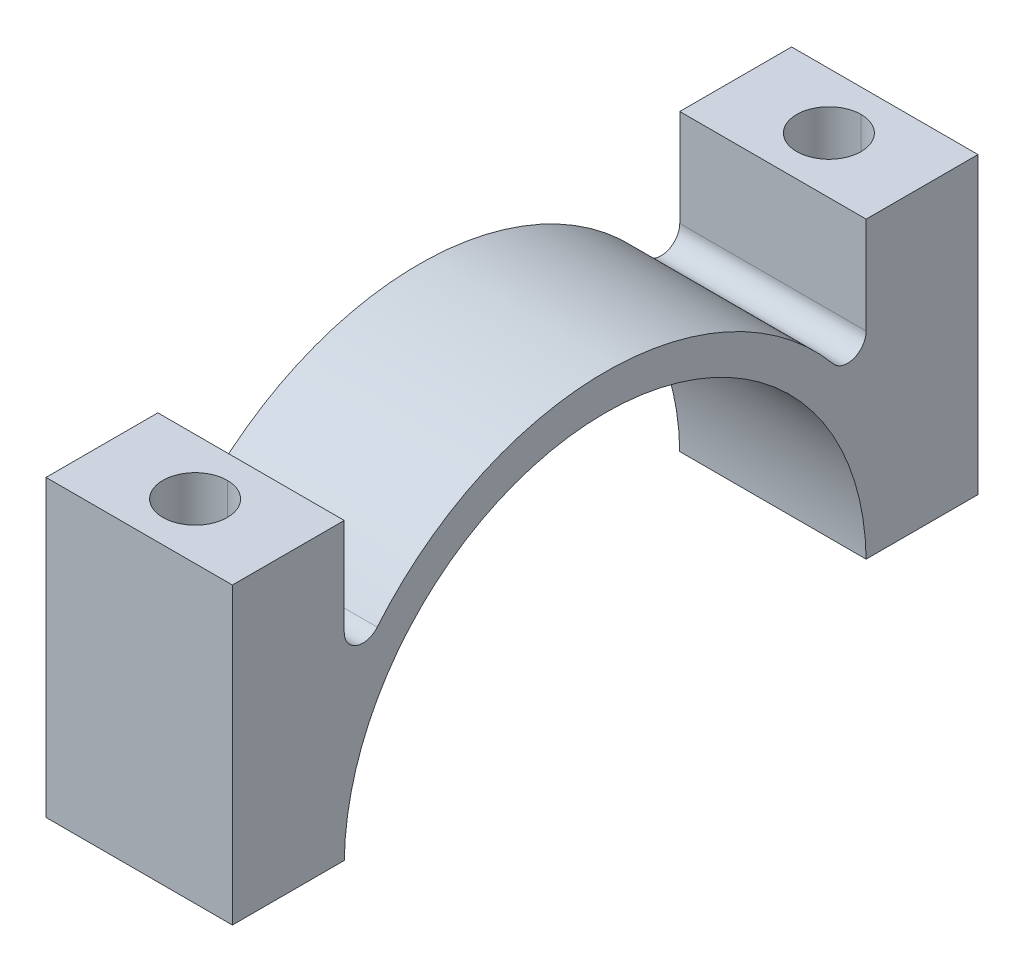
ISO-10303-21;
HEADER;
FILE_DESCRIPTION(('STEP AP214'),'2;1');
FILE_NAME('part.step','',(''),(''),'','','');
FILE_SCHEMA(('AUTOMOTIVE_DESIGN { 1 0 10303 214 1 1 1 1 }'));
ENDSEC;
DATA;
#1=APPLICATION_CONTEXT('core data for automotive mechanical design processes');
#2=APPLICATION_PROTOCOL_DEFINITION('international standard','automotive_design',2000,#1);
#3=PRODUCT_CONTEXT('',#1,'mechanical');
#4=PRODUCT('Part','Part','',(#3));
#5=PRODUCT_RELATED_PRODUCT_CATEGORY('part','',(#4));
#6=PRODUCT_DEFINITION_FORMATION('','',#4);
#7=PRODUCT_DEFINITION_CONTEXT('part definition',#1,'design');
#8=PRODUCT_DEFINITION('design','',#6,#7);
#9=PRODUCT_DEFINITION_SHAPE('','',#8);
#10=(LENGTH_UNIT() NAMED_UNIT(*) SI_UNIT(.MILLI.,.METRE.));
#11=(NAMED_UNIT(*) PLANE_ANGLE_UNIT() SI_UNIT($,.RADIAN.));
#12=(NAMED_UNIT(*) SI_UNIT($,.STERADIAN.) SOLID_ANGLE_UNIT());
#13=UNCERTAINTY_MEASURE_WITH_UNIT(LENGTH_MEASURE(1.E-05),#10,'distance_accuracy_value','');
#14=(GEOMETRIC_REPRESENTATION_CONTEXT(3) GLOBAL_UNCERTAINTY_ASSIGNED_CONTEXT((#13)) GLOBAL_UNIT_ASSIGNED_CONTEXT((#10,
#11,#12)) REPRESENTATION_CONTEXT('',''));
#15=CARTESIAN_POINT('',(0.,0.,0.));
#16=DIRECTION('',(0.,0.,1.));
#17=DIRECTION('',(1.,0.,0.));
#18=AXIS2_PLACEMENT_3D('',#15,#16,#17);
#19=CARTESIAN_POINT('',(5.,0.2,-17.));
#20=DIRECTION('',(0.,-1.,0.));
#21=DIRECTION('',(0.,0.,-1.));
#22=AXIS2_PLACEMENT_3D('',#19,#20,#21);
#23=CYLINDRICAL_SURFACE('',#22,1.7272);
#24=DIRECTION('',(0.,-1.,0.));
#25=VECTOR('',#24,1.);
#26=CARTESIAN_POINT('',(5.,0.2,-15.2728));
#27=LINE('',#26,#25);
#28=CARTESIAN_POINT('',(5.,16.,-15.2728));
#29=VERTEX_POINT('',#28);
#30=CARTESIAN_POINT('',(5.,0.2,-15.2728));
#31=VERTEX_POINT('',#30);
#32=EDGE_CURVE('E270',#29,#31,#27,.T.);
#33=ORIENTED_EDGE('',*,*,#32,.F.);
#34=CARTESIAN_POINT('',(5.,16.,-17.));
#35=DIRECTION('',(0.,-1.,0.));
#36=DIRECTION('',(0.,0.,-1.));
#37=AXIS2_PLACEMENT_3D('',#34,#35,#36);
#38=CIRCLE('',#37,1.7272);
#39=CARTESIAN_POINT('',(5.,16.,-18.7272));
#40=VERTEX_POINT('',#39);
#41=EDGE_CURVE('E202',#40,#29,#38,.T.);
#42=ORIENTED_EDGE('',*,*,#41,.F.);
#43=DIRECTION('',(0.,-1.,0.));
#44=VECTOR('',#43,1.);
#45=CARTESIAN_POINT('',(5.,0.2,-18.7272));
#46=LINE('',#45,#44);
#47=CARTESIAN_POINT('',(5.,0.2,-18.7272));
#48=VERTEX_POINT('',#47);
#49=EDGE_CURVE('E250',#40,#48,#46,.T.);
#50=ORIENTED_EDGE('',*,*,#49,.T.);
#51=CARTESIAN_POINT('',(5.,0.2,-17.));
#52=DIRECTION('',(0.,-1.,0.));
#53=DIRECTION('',(0.,0.,-1.));
#54=AXIS2_PLACEMENT_3D('',#51,#52,#53);
#55=CIRCLE('',#54,1.7272);
#56=EDGE_CURVE('E246',#48,#31,#55,.T.);
#57=ORIENTED_EDGE('',*,*,#56,.T.);
#58=EDGE_LOOP('',(#33,#42,#50,#57));
#59=FACE_BOUND('',#58,.T.);
#60=ADVANCED_FACE('F16',(#59),#23,.F.);
#61=CARTESIAN_POINT('',(5.,0.200000000000004,17.));
#62=DIRECTION('',(0.,-1.,0.));
#63=DIRECTION('',(0.,0.,-1.));
#64=AXIS2_PLACEMENT_3D('',#61,#62,#63);
#65=CYLINDRICAL_SURFACE('',#64,1.7272);
#66=DIRECTION('',(0.,-1.,0.));
#67=VECTOR('',#66,1.);
#68=CARTESIAN_POINT('',(5.,0.200000000000004,18.7272));
#69=LINE('',#68,#67);
#70=CARTESIAN_POINT('',(5.,16.,18.7272));
#71=VERTEX_POINT('',#70);
#72=CARTESIAN_POINT('',(5.,0.200000000000004,18.7272));
#73=VERTEX_POINT('',#72);
#74=EDGE_CURVE('E221',#71,#73,#69,.T.);
#75=ORIENTED_EDGE('',*,*,#74,.F.);
#76=CARTESIAN_POINT('',(5.,16.,17.));
#77=DIRECTION('',(0.,-1.,0.));
#78=DIRECTION('',(0.,0.,-1.));
#79=AXIS2_PLACEMENT_3D('',#76,#77,#78);
#80=CIRCLE('',#79,1.7272);
#81=CARTESIAN_POINT('',(5.,16.,15.2728));
#82=VERTEX_POINT('',#81);
#83=EDGE_CURVE('E230',#82,#71,#80,.T.);
#84=ORIENTED_EDGE('',*,*,#83,.F.);
#85=DIRECTION('',(0.,-1.,0.));
#86=VECTOR('',#85,1.);
#87=CARTESIAN_POINT('',(5.,0.200000000000004,15.2728));
#88=LINE('',#87,#86);
#89=CARTESIAN_POINT('',(5.,0.200000000000004,15.2728));
#90=VERTEX_POINT('',#89);
#91=EDGE_CURVE('E220',#82,#90,#88,.T.);
#92=ORIENTED_EDGE('',*,*,#91,.T.);
#93=CARTESIAN_POINT('',(5.,0.200000000000004,17.));
#94=DIRECTION('',(0.,-1.,0.));
#95=DIRECTION('',(0.,0.,-1.));
#96=AXIS2_PLACEMENT_3D('',#93,#94,#95);
#97=CIRCLE('',#96,1.7272);
#98=EDGE_CURVE('E167',#90,#73,#97,.T.);
#99=ORIENTED_EDGE('',*,*,#98,.T.);
#100=EDGE_LOOP('',(#75,#84,#92,#99));
#101=FACE_BOUND('',#100,.T.);
#102=ADVANCED_FACE('F429',(#101),#65,.F.);
#103=CARTESIAN_POINT('',(10.,10.7986110217935,-13.));
#104=DIRECTION('',(-1.,0.,0.));
#105=DIRECTION('',(0.,0.,1.));
#106=AXIS2_PLACEMENT_3D('',#103,#104,#105);
#107=CYLINDRICAL_SURFACE('',#106,1.);
#108=CARTESIAN_POINT('',(10.,10.7986110217935,-13.));
#109=DIRECTION('',(-1.,0.,0.));
#110=DIRECTION('',(0.,0.,1.));
#111=AXIS2_PLACEMENT_3D('',#108,#109,#110);
#112=CIRCLE('',#111,1.);
#113=CARTESIAN_POINT('',(10.,10.7986110217935,-14.));
#114=VERTEX_POINT('',#113);
#115=CARTESIAN_POINT('',(10.,10.1596399554152,-12.2307692307692));
#116=VERTEX_POINT('',#115);
#117=EDGE_CURVE('E155',#114,#116,#112,.T.);
#118=ORIENTED_EDGE('',*,*,#117,.F.);
#119=DIRECTION('',(1.,0.,0.));
#120=VECTOR('',#119,1.);
#121=CARTESIAN_POINT('',(10.,10.7986110217935,-14.));
#122=LINE('',#121,#120);
#123=CARTESIAN_POINT('',(0.,10.7986110217935,-14.));
#124=VERTEX_POINT('',#123);
#125=EDGE_CURVE('E11',#124,#114,#122,.T.);
#126=ORIENTED_EDGE('',*,*,#125,.F.);
#127=CARTESIAN_POINT('',(0.,10.7986110217935,-13.));
#128=DIRECTION('',(1.,0.,0.));
#129=DIRECTION('',(0.,0.,1.));
#130=AXIS2_PLACEMENT_3D('',#127,#128,#129);
#131=CIRCLE('',#130,1.);
#132=CARTESIAN_POINT('',(0.,10.1596399554152,-12.2307692307692));
#133=VERTEX_POINT('',#132);
#134=EDGE_CURVE('E20',#133,#124,#131,.T.);
#135=ORIENTED_EDGE('',*,*,#134,.F.);
#136=DIRECTION('',(-1.,0.,0.));
#137=VECTOR('',#136,1.);
#138=CARTESIAN_POINT('',(10.,10.1596399554152,-12.2307692307692));
#139=LINE('',#138,#137);
#140=EDGE_CURVE('E27',#116,#133,#139,.T.);
#141=ORIENTED_EDGE('',*,*,#140,.F.);
#142=EDGE_LOOP('',(#118,#126,#135,#141));
#143=FACE_BOUND('',#142,.T.);
#144=ADVANCED_FACE('F156',(#143),#107,.F.);
#145=CARTESIAN_POINT('',(10.,10.7986110217935,13.));
#146=DIRECTION('',(-1.,0.,0.));
#147=DIRECTION('',(0.,0.,1.));
#148=AXIS2_PLACEMENT_3D('',#145,#146,#147);
#149=CYLINDRICAL_SURFACE('',#148,1.);
#150=CARTESIAN_POINT('',(10.,10.7986110217935,13.));
#151=DIRECTION('',(-1.,0.,0.));
#152=DIRECTION('',(0.,0.,1.));
#153=AXIS2_PLACEMENT_3D('',#150,#151,#152);
#154=CIRCLE('',#153,1.);
#155=CARTESIAN_POINT('',(10.,10.1596399554152,12.2307692307692));
#156=VERTEX_POINT('',#155);
#157=CARTESIAN_POINT('',(10.,10.7986110217935,14.));
#158=VERTEX_POINT('',#157);
#159=EDGE_CURVE('E190',#156,#158,#154,.T.);
#160=ORIENTED_EDGE('',*,*,#159,.F.);
#161=DIRECTION('',(1.,0.,0.));
#162=VECTOR('',#161,1.);
#163=CARTESIAN_POINT('',(10.,10.1596399554152,12.2307692307692));
#164=LINE('',#163,#162);
#165=CARTESIAN_POINT('',(0.,10.1596399554152,12.2307692307692));
#166=VERTEX_POINT('',#165);
#167=EDGE_CURVE('E211',#166,#156,#164,.T.);
#168=ORIENTED_EDGE('',*,*,#167,.F.);
#169=CARTESIAN_POINT('',(0.,10.7986110217935,13.));
#170=DIRECTION('',(1.,0.,0.));
#171=DIRECTION('',(0.,0.,1.));
#172=AXIS2_PLACEMENT_3D('',#169,#170,#171);
#173=CIRCLE('',#172,1.);
#174=CARTESIAN_POINT('',(0.,10.7986110217935,14.));
#175=VERTEX_POINT('',#174);
#176=EDGE_CURVE('E212',#175,#166,#173,.T.);
#177=ORIENTED_EDGE('',*,*,#176,.F.);
#178=DIRECTION('',(-1.,0.,0.));
#179=VECTOR('',#178,1.);
#180=CARTESIAN_POINT('',(0.,10.7986110217935,14.));
#181=LINE('',#180,#179);
#182=EDGE_CURVE('E376',#158,#175,#181,.T.);
#183=ORIENTED_EDGE('',*,*,#182,.F.);
#184=EDGE_LOOP('',(#160,#168,#177,#183));
#185=FACE_BOUND('',#184,.T.);
#186=ADVANCED_FACE('F400',(#185),#149,.F.);
#187=CARTESIAN_POINT('',(10.,16.,-14.));
#188=DIRECTION('',(0.,0.,-1.));
#189=DIRECTION('',(0.,-1.,0.));
#190=AXIS2_PLACEMENT_3D('',#187,#188,#189);
#191=PLANE('',#190);
#192=DIRECTION('',(0.,-1.,0.));
#193=VECTOR('',#192,1.);
#194=CARTESIAN_POINT('',(0.,16.,-14.));
#195=LINE('',#194,#193);
#196=CARTESIAN_POINT('',(0.,16.,-14.));
#197=VERTEX_POINT('',#196);
#198=EDGE_CURVE('E152',#197,#124,#195,.T.);
#199=ORIENTED_EDGE('',*,*,#198,.T.);
#200=ORIENTED_EDGE('',*,*,#125,.T.);
#201=DIRECTION('',(0.,-1.,0.));
#202=VECTOR('',#201,1.);
#203=CARTESIAN_POINT('',(10.,16.,-14.));
#204=LINE('',#203,#202);
#205=CARTESIAN_POINT('',(10.,16.,-14.));
#206=VERTEX_POINT('',#205);
#207=EDGE_CURVE('E150',#206,#114,#204,.T.);
#208=ORIENTED_EDGE('',*,*,#207,.F.);
#209=DIRECTION('',(-1.,0.,0.));
#210=VECTOR('',#209,1.);
#211=CARTESIAN_POINT('',(10.,16.,-14.));
#212=LINE('',#211,#210);
#213=EDGE_CURVE('E285',#206,#197,#212,.T.);
#214=ORIENTED_EDGE('',*,*,#213,.T.);
#215=EDGE_LOOP('',(#199,#200,#208,#214));
#216=FACE_BOUND('',#215,.T.);
#217=ADVANCED_FACE('F147',(#216),#191,.F.);
#218=CARTESIAN_POINT('',(10.,0.,0.));
#219=DIRECTION('',(-1.,0.,0.));
#220=DIRECTION('',(0.,0.,1.));
#221=AXIS2_PLACEMENT_3D('',#218,#219,#220);
#222=CYLINDRICAL_SURFACE('',#221,15.9);
#223=CARTESIAN_POINT('',(0.,0.,0.));
#224=DIRECTION('',(1.,0.,0.));
#225=DIRECTION('',(0.,0.,-1.));
#226=AXIS2_PLACEMENT_3D('',#223,#224,#225);
#227=CIRCLE('',#226,15.9);
#228=EDGE_CURVE('E178',#133,#166,#227,.T.);
#229=ORIENTED_EDGE('',*,*,#228,.T.);
#230=ORIENTED_EDGE('',*,*,#167,.T.);
#231=CARTESIAN_POINT('',(10.,0.,0.));
#232=DIRECTION('',(1.,0.,0.));
#233=DIRECTION('',(0.,0.,-1.));
#234=AXIS2_PLACEMENT_3D('',#231,#232,#233);
#235=CIRCLE('',#234,15.9);
#236=EDGE_CURVE('E160',#116,#156,#235,.T.);
#237=ORIENTED_EDGE('',*,*,#236,.F.);
#238=ORIENTED_EDGE('',*,*,#140,.T.);
#239=EDGE_LOOP('',(#229,#230,#237,#238));
#240=FACE_BOUND('',#239,.T.);
#241=ADVANCED_FACE('F396',(#240),#222,.T.);
#242=CARTESIAN_POINT('',(10.,16.,14.));
#243=DIRECTION('',(0.,0.,1.));
#244=DIRECTION('',(1.,0.,0.));
#245=AXIS2_PLACEMENT_3D('',#242,#243,#244);
#246=PLANE('',#245);
#247=DIRECTION('',(0.,1.,0.));
#248=VECTOR('',#247,1.);
#249=CARTESIAN_POINT('',(10.,16.,14.));
#250=LINE('',#249,#248);
#251=CARTESIAN_POINT('',(10.,16.,14.));
#252=VERTEX_POINT('',#251);
#253=EDGE_CURVE('E186',#158,#252,#250,.T.);
#254=ORIENTED_EDGE('',*,*,#253,.F.);
#255=ORIENTED_EDGE('',*,*,#182,.T.);
#256=DIRECTION('',(0.,1.,0.));
#257=VECTOR('',#256,1.);
#258=CARTESIAN_POINT('',(0.,16.,14.));
#259=LINE('',#258,#257);
#260=CARTESIAN_POINT('',(0.,16.,14.));
#261=VERTEX_POINT('',#260);
#262=EDGE_CURVE('E189',#175,#261,#259,.T.);
#263=ORIENTED_EDGE('',*,*,#262,.T.);
#264=DIRECTION('',(-1.,0.,0.));
#265=VECTOR('',#264,1.);
#266=CARTESIAN_POINT('',(10.,16.,14.));
#267=LINE('',#266,#265);
#268=EDGE_CURVE('E231',#252,#261,#267,.T.);
#269=ORIENTED_EDGE('',*,*,#268,.F.);
#270=EDGE_LOOP('',(#254,#255,#263,#269));
#271=FACE_BOUND('',#270,.T.);
#272=ADVANCED_FACE('F403',(#271),#246,.F.);
#273=CARTESIAN_POINT('',(0.,0.,0.));
#274=DIRECTION('',(-1.,0.,0.));
#275=DIRECTION('',(0.,0.,1.));
#276=AXIS2_PLACEMENT_3D('',#273,#274,#275);
#277=PLANE('',#276);
#278=ORIENTED_EDGE('',*,*,#262,.F.);
#279=ORIENTED_EDGE('',*,*,#176,.T.);
#280=ORIENTED_EDGE('',*,*,#228,.F.);
#281=ORIENTED_EDGE('',*,*,#134,.T.);
#282=ORIENTED_EDGE('',*,*,#198,.F.);
#283=DIRECTION('',(0.,0.,1.));
#284=VECTOR('',#283,1.);
#285=CARTESIAN_POINT('',(0.,16.,20.));
#286=LINE('',#285,#284);
#287=CARTESIAN_POINT('',(0.,16.,-20.));
#288=VERTEX_POINT('',#287);
#289=EDGE_CURVE('E225',#288,#197,#286,.T.);
#290=ORIENTED_EDGE('',*,*,#289,.F.);
#291=DIRECTION('',(0.,1.,0.));
#292=VECTOR('',#291,1.);
#293=CARTESIAN_POINT('',(0.,16.,-20.));
#294=LINE('',#293,#292);
#295=CARTESIAN_POINT('',(0.,0.2,-20.));
#296=VERTEX_POINT('',#295);
#297=EDGE_CURVE('E195',#296,#288,#294,.T.);
#298=ORIENTED_EDGE('',*,*,#297,.F.);
#299=DIRECTION('',(0.,0.,-1.));
#300=VECTOR('',#299,1.);
#301=CARTESIAN_POINT('',(0.,0.2,-20.));
#302=LINE('',#301,#300);
#303=CARTESIAN_POINT('',(0.,0.2,-13.9985713556777));
#304=VERTEX_POINT('',#303);
#305=EDGE_CURVE('E185',#304,#296,#302,.T.);
#306=ORIENTED_EDGE('',*,*,#305,.F.);
#307=CARTESIAN_POINT('',(0.,0.,0.));
#308=DIRECTION('',(-1.,0.,0.));
#309=DIRECTION('',(0.,0.,1.));
#310=AXIS2_PLACEMENT_3D('',#307,#308,#309);
#311=CIRCLE('',#310,14.);
#312=CARTESIAN_POINT('',(0.,0.2,13.9985713556777));
#313=VERTEX_POINT('',#312);
#314=EDGE_CURVE('E204',#313,#304,#311,.T.);
#315=ORIENTED_EDGE('',*,*,#314,.F.);
#316=DIRECTION('',(0.,0.,-1.));
#317=VECTOR('',#316,1.);
#318=CARTESIAN_POINT('',(0.,0.2,13.9985713556777));
#319=LINE('',#318,#317);
#320=CARTESIAN_POINT('',(0.,0.2,20.));
#321=VERTEX_POINT('',#320);
#322=EDGE_CURVE('E208',#321,#313,#319,.T.);
#323=ORIENTED_EDGE('',*,*,#322,.F.);
#324=DIRECTION('',(0.,-1.,0.));
#325=VECTOR('',#324,1.);
#326=CARTESIAN_POINT('',(0.,0.2,20.));
#327=LINE('',#326,#325);
#328=CARTESIAN_POINT('',(0.,16.,20.));
#329=VERTEX_POINT('',#328);
#330=EDGE_CURVE('E197',#329,#321,#327,.T.);
#331=ORIENTED_EDGE('',*,*,#330,.F.);
#332=DIRECTION('',(0.,0.,1.));
#333=VECTOR('',#332,1.);
#334=CARTESIAN_POINT('',(0.,16.,20.));
#335=LINE('',#334,#333);
#336=EDGE_CURVE('E235',#261,#329,#335,.T.);
#337=ORIENTED_EDGE('',*,*,#336,.F.);
#338=EDGE_LOOP('',(#278,#279,#280,#281,#282,#290,#298,#306,#315,#323,#331,#337));
#339=FACE_BOUND('',#338,.T.);
#340=ADVANCED_FACE('F18',(#339),#277,.T.);
#341=CARTESIAN_POINT('',(10.,0.,0.));
#342=DIRECTION('',(-1.,0.,0.));
#343=DIRECTION('',(0.,0.,1.));
#344=AXIS2_PLACEMENT_3D('',#341,#342,#343);
#345=PLANE('',#344);
#346=ORIENTED_EDGE('',*,*,#207,.T.);
#347=ORIENTED_EDGE('',*,*,#117,.T.);
#348=ORIENTED_EDGE('',*,*,#236,.T.);
#349=ORIENTED_EDGE('',*,*,#159,.T.);
#350=ORIENTED_EDGE('',*,*,#253,.T.);
#351=DIRECTION('',(0.,0.,1.));
#352=VECTOR('',#351,1.);
#353=CARTESIAN_POINT('',(10.,16.,20.));
#354=LINE('',#353,#352);
#355=CARTESIAN_POINT('',(10.,16.,20.));
#356=VERTEX_POINT('',#355);
#357=EDGE_CURVE('E236',#252,#356,#354,.T.);
#358=ORIENTED_EDGE('',*,*,#357,.T.);
#359=DIRECTION('',(0.,-1.,0.));
#360=VECTOR('',#359,1.);
#361=CARTESIAN_POINT('',(10.,0.2,20.));
#362=LINE('',#361,#360);
#363=CARTESIAN_POINT('',(10.,0.2,20.));
#364=VERTEX_POINT('',#363);
#365=EDGE_CURVE('E348',#356,#364,#362,.T.);
#366=ORIENTED_EDGE('',*,*,#365,.T.);
#367=DIRECTION('',(0.,0.,-1.));
#368=VECTOR('',#367,1.);
#369=CARTESIAN_POINT('',(10.,0.2,13.9985713556777));
#370=LINE('',#369,#368);
#371=CARTESIAN_POINT('',(10.,0.2,13.9985713556777));
#372=VERTEX_POINT('',#371);
#373=EDGE_CURVE('E174',#364,#372,#370,.T.);
#374=ORIENTED_EDGE('',*,*,#373,.T.);
#375=CARTESIAN_POINT('',(10.,0.,0.));
#376=DIRECTION('',(-1.,0.,0.));
#377=DIRECTION('',(0.,0.,1.));
#378=AXIS2_PLACEMENT_3D('',#375,#376,#377);
#379=CIRCLE('',#378,14.);
#380=CARTESIAN_POINT('',(10.,0.2,-13.9985713556777));
#381=VERTEX_POINT('',#380);
#382=EDGE_CURVE('E196',#372,#381,#379,.T.);
#383=ORIENTED_EDGE('',*,*,#382,.T.);
#384=DIRECTION('',(0.,0.,-1.));
#385=VECTOR('',#384,1.);
#386=CARTESIAN_POINT('',(10.,0.2,-20.));
#387=LINE('',#386,#385);
#388=CARTESIAN_POINT('',(10.,0.2,-20.));
#389=VERTEX_POINT('',#388);
#390=EDGE_CURVE('E184',#381,#389,#387,.T.);
#391=ORIENTED_EDGE('',*,*,#390,.T.);
#392=DIRECTION('',(0.,1.,0.));
#393=VECTOR('',#392,1.);
#394=CARTESIAN_POINT('',(10.,16.,-20.));
#395=LINE('',#394,#393);
#396=CARTESIAN_POINT('',(10.,16.,-20.));
#397=VERTEX_POINT('',#396);
#398=EDGE_CURVE('E222',#389,#397,#395,.T.);
#399=ORIENTED_EDGE('',*,*,#398,.T.);
#400=DIRECTION('',(0.,0.,1.));
#401=VECTOR('',#400,1.);
#402=CARTESIAN_POINT('',(10.,16.,20.));
#403=LINE('',#402,#401);
#404=EDGE_CURVE('E164',#397,#206,#403,.T.);
#405=ORIENTED_EDGE('',*,*,#404,.T.);
#406=EDGE_LOOP('',(#346,#347,#348,#349,#350,#358,#366,#374,#383,#391,#399,#405));
#407=FACE_BOUND('',#406,.T.);
#408=ADVANCED_FACE('F162',(#407),#345,.F.);
#409=CARTESIAN_POINT('',(10.,0.2,13.9985713556777));
#410=DIRECTION('',(0.,1.,0.));
#411=DIRECTION('',(0.,0.,-1.));
#412=AXIS2_PLACEMENT_3D('',#409,#410,#411);
#413=PLANE('',#412);
#414=ORIENTED_EDGE('',*,*,#98,.F.);
#415=CARTESIAN_POINT('',(5.,0.200000000000004,17.));
#416=DIRECTION('',(0.,-1.,0.));
#417=DIRECTION('',(0.,0.,-1.));
#418=AXIS2_PLACEMENT_3D('',#415,#416,#417);
#419=CIRCLE('',#418,1.7272);
#420=EDGE_CURVE('E216',#73,#90,#419,.T.);
#421=ORIENTED_EDGE('',*,*,#420,.F.);
#422=EDGE_LOOP('',(#414,#421));
#423=FACE_BOUND('',#422,.T.);
#424=ORIENTED_EDGE('',*,*,#322,.T.);
#425=DIRECTION('',(-1.,0.,0.));
#426=VECTOR('',#425,1.);
#427=CARTESIAN_POINT('',(10.,0.2,13.9985713556777));
#428=LINE('',#427,#426);
#429=EDGE_CURVE('E191',#372,#313,#428,.T.);
#430=ORIENTED_EDGE('',*,*,#429,.F.);
#431=ORIENTED_EDGE('',*,*,#373,.F.);
#432=DIRECTION('',(-1.,0.,0.));
#433=VECTOR('',#432,1.);
#434=CARTESIAN_POINT('',(10.,0.2,20.));
#435=LINE('',#434,#433);
#436=EDGE_CURVE('E201',#364,#321,#435,.T.);
#437=ORIENTED_EDGE('',*,*,#436,.T.);
#438=EDGE_LOOP('',(#424,#430,#431,#437));
#439=FACE_BOUND('',#438,.T.);
#440=ADVANCED_FACE('F410',(#423,#439),#413,.F.);
#441=CARTESIAN_POINT('',(10.,0.2,20.));
#442=DIRECTION('',(0.,0.,-1.));
#443=DIRECTION('',(-1.,0.,0.));
#444=AXIS2_PLACEMENT_3D('',#441,#442,#443);
#445=PLANE('',#444);
#446=ORIENTED_EDGE('',*,*,#330,.T.);
#447=ORIENTED_EDGE('',*,*,#436,.F.);
#448=ORIENTED_EDGE('',*,*,#365,.F.);
#449=DIRECTION('',(-1.,0.,0.));
#450=VECTOR('',#449,1.);
#451=CARTESIAN_POINT('',(10.,16.,20.));
#452=LINE('',#451,#450);
#453=EDGE_CURVE('E240',#356,#329,#452,.T.);
#454=ORIENTED_EDGE('',*,*,#453,.T.);
#455=EDGE_LOOP('',(#446,#447,#448,#454));
#456=FACE_BOUND('',#455,.T.);
#457=ADVANCED_FACE('F408',(#456),#445,.F.);
#458=CARTESIAN_POINT('',(10.,16.,20.));
#459=DIRECTION('',(0.,-1.,0.));
#460=DIRECTION('',(0.,0.,-1.));
#461=AXIS2_PLACEMENT_3D('',#458,#459,#460);
#462=PLANE('',#461);
#463=ORIENTED_EDGE('',*,*,#41,.T.);
#464=CARTESIAN_POINT('',(5.,16.,-17.));
#465=DIRECTION('',(0.,-1.,0.));
#466=DIRECTION('',(0.,0.,-1.));
#467=AXIS2_PLACEMENT_3D('',#464,#465,#466);
#468=CIRCLE('',#467,1.7272);
#469=EDGE_CURVE('E278',#29,#40,#468,.T.);
#470=ORIENTED_EDGE('',*,*,#469,.T.);
#471=EDGE_LOOP('',(#463,#470));
#472=FACE_BOUND('',#471,.T.);
#473=ORIENTED_EDGE('',*,*,#289,.T.);
#474=ORIENTED_EDGE('',*,*,#213,.F.);
#475=ORIENTED_EDGE('',*,*,#404,.F.);
#476=DIRECTION('',(-1.,0.,0.));
#477=VECTOR('',#476,1.);
#478=CARTESIAN_POINT('',(10.,16.,-20.));
#479=LINE('',#478,#477);
#480=EDGE_CURVE('E226',#397,#288,#479,.T.);
#481=ORIENTED_EDGE('',*,*,#480,.T.);
#482=EDGE_LOOP('',(#473,#474,#475,#481));
#483=FACE_BOUND('',#482,.T.);
#484=ADVANCED_FACE('F417',(#472,#483),#462,.F.);
#485=CARTESIAN_POINT('',(10.,16.,-20.));
#486=DIRECTION('',(0.,0.,1.));
#487=DIRECTION('',(0.,-1.,0.));
#488=AXIS2_PLACEMENT_3D('',#485,#486,#487);
#489=PLANE('',#488);
#490=ORIENTED_EDGE('',*,*,#297,.T.);
#491=ORIENTED_EDGE('',*,*,#480,.F.);
#492=ORIENTED_EDGE('',*,*,#398,.F.);
#493=DIRECTION('',(-1.,0.,0.));
#494=VECTOR('',#493,1.);
#495=CARTESIAN_POINT('',(10.,0.2,-20.));
#496=LINE('',#495,#494);
#497=EDGE_CURVE('E180',#389,#296,#496,.T.);
#498=ORIENTED_EDGE('',*,*,#497,.T.);
#499=EDGE_LOOP('',(#490,#491,#492,#498));
#500=FACE_BOUND('',#499,.T.);
#501=ADVANCED_FACE('F415',(#500),#489,.F.);
#502=CARTESIAN_POINT('',(10.,0.,0.));
#503=DIRECTION('',(-1.,0.,0.));
#504=DIRECTION('',(0.,0.,1.));
#505=AXIS2_PLACEMENT_3D('',#502,#503,#504);
#506=CYLINDRICAL_SURFACE('',#505,14.);
#507=ORIENTED_EDGE('',*,*,#314,.T.);
#508=DIRECTION('',(-1.,0.,0.));
#509=VECTOR('',#508,1.);
#510=CARTESIAN_POINT('',(10.,0.2,-13.9985713556777));
#511=LINE('',#510,#509);
#512=EDGE_CURVE('E243',#381,#304,#511,.T.);
#513=ORIENTED_EDGE('',*,*,#512,.F.);
#514=ORIENTED_EDGE('',*,*,#382,.F.);
#515=ORIENTED_EDGE('',*,*,#429,.T.);
#516=EDGE_LOOP('',(#507,#513,#514,#515));
#517=FACE_BOUND('',#516,.T.);
#518=ADVANCED_FACE('F412',(#517),#506,.F.);
#519=CARTESIAN_POINT('',(10.,16.,20.));
#520=DIRECTION('',(0.,-1.,0.));
#521=DIRECTION('',(0.,0.,-1.));
#522=AXIS2_PLACEMENT_3D('',#519,#520,#521);
#523=PLANE('',#522);
#524=ORIENTED_EDGE('',*,*,#83,.T.);
#525=CARTESIAN_POINT('',(5.,16.,17.));
#526=DIRECTION('',(0.,-1.,0.));
#527=DIRECTION('',(0.,0.,-1.));
#528=AXIS2_PLACEMENT_3D('',#525,#526,#527);
#529=CIRCLE('',#528,1.7272);
#530=EDGE_CURVE('E247',#71,#82,#529,.T.);
#531=ORIENTED_EDGE('',*,*,#530,.T.);
#532=EDGE_LOOP('',(#524,#531));
#533=FACE_BOUND('',#532,.T.);
#534=ORIENTED_EDGE('',*,*,#357,.F.);
#535=ORIENTED_EDGE('',*,*,#268,.T.);
#536=ORIENTED_EDGE('',*,*,#336,.T.);
#537=ORIENTED_EDGE('',*,*,#453,.F.);
#538=EDGE_LOOP('',(#534,#535,#536,#537));
#539=FACE_BOUND('',#538,.T.);
#540=ADVANCED_FACE('F406',(#533,#539),#523,.F.);
#541=CARTESIAN_POINT('',(10.,0.2,-20.));
#542=DIRECTION('',(0.,1.,0.));
#543=DIRECTION('',(0.,0.,-1.));
#544=AXIS2_PLACEMENT_3D('',#541,#542,#543);
#545=PLANE('',#544);
#546=ORIENTED_EDGE('',*,*,#56,.F.);
#547=CARTESIAN_POINT('',(5.,0.2,-17.));
#548=DIRECTION('',(0.,-1.,0.));
#549=DIRECTION('',(0.,0.,-1.));
#550=AXIS2_PLACEMENT_3D('',#547,#548,#549);
#551=CIRCLE('',#550,1.7272);
#552=EDGE_CURVE('E260',#31,#48,#551,.T.);
#553=ORIENTED_EDGE('',*,*,#552,.F.);
#554=EDGE_LOOP('',(#546,#553));
#555=FACE_BOUND('',#554,.T.);
#556=ORIENTED_EDGE('',*,*,#305,.T.);
#557=ORIENTED_EDGE('',*,*,#497,.F.);
#558=ORIENTED_EDGE('',*,*,#390,.F.);
#559=ORIENTED_EDGE('',*,*,#512,.T.);
#560=EDGE_LOOP('',(#556,#557,#558,#559));
#561=FACE_BOUND('',#560,.T.);
#562=ADVANCED_FACE('F305',(#555,#561),#545,.F.);
#563=CARTESIAN_POINT('',(5.,0.200000000000004,17.));
#564=DIRECTION('',(0.,-1.,0.));
#565=DIRECTION('',(0.,0.,-1.));
#566=AXIS2_PLACEMENT_3D('',#563,#564,#565);
#567=CYLINDRICAL_SURFACE('',#566,1.7272);
#568=ORIENTED_EDGE('',*,*,#530,.F.);
#569=ORIENTED_EDGE('',*,*,#74,.T.);
#570=ORIENTED_EDGE('',*,*,#420,.T.);
#571=ORIENTED_EDGE('',*,*,#91,.F.);
#572=EDGE_LOOP('',(#568,#569,#570,#571));
#573=FACE_BOUND('',#572,.T.);
#574=ADVANCED_FACE('F439',(#573),#567,.F.);
#575=CARTESIAN_POINT('',(5.,0.2,-17.));
#576=DIRECTION('',(0.,-1.,0.));
#577=DIRECTION('',(0.,0.,-1.));
#578=AXIS2_PLACEMENT_3D('',#575,#576,#577);
#579=CYLINDRICAL_SURFACE('',#578,1.7272);
#580=ORIENTED_EDGE('',*,*,#469,.F.);
#581=ORIENTED_EDGE('',*,*,#32,.T.);
#582=ORIENTED_EDGE('',*,*,#552,.T.);
#583=ORIENTED_EDGE('',*,*,#49,.F.);
#584=EDGE_LOOP('',(#580,#581,#582,#583));
#585=FACE_BOUND('',#584,.T.);
#586=ADVANCED_FACE('F337',(#585),#579,.F.);
#587=CLOSED_SHELL('',(#60,#102,#144,#186,#217,#241,#272,#340,#408,#440,#457,#484,#501,#518,#540,
#562,#574,#586));
#588=MANIFOLD_SOLID_BREP('B1',#587);
#589=ADVANCED_BREP_SHAPE_REPRESENTATION('',(#18,#588),#14);
#590=SHAPE_DEFINITION_REPRESENTATION(#9,#589);
ENDSEC;
END-ISO-10303-21;
